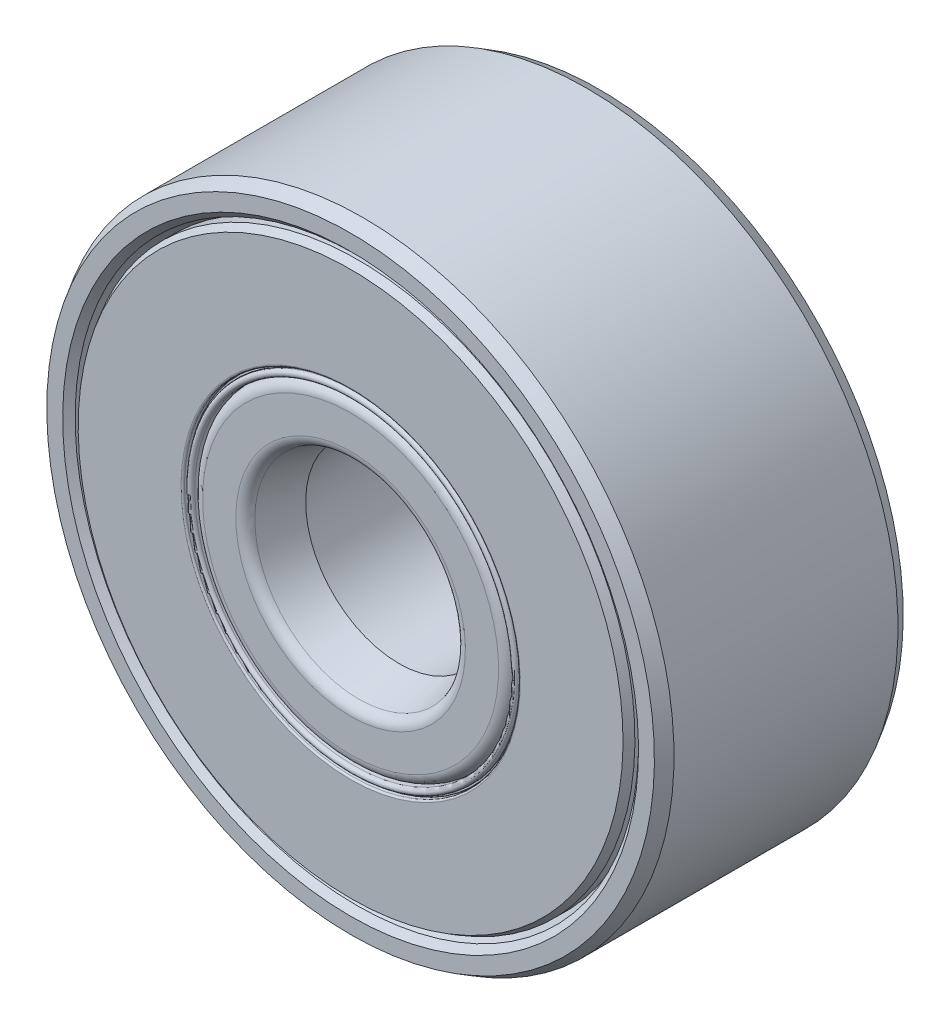
ISO-10303-21;
HEADER;
FILE_DESCRIPTION(('STEP AP214'),'2;1');
FILE_NAME('part.step','',(''),(''),'','','');
FILE_SCHEMA(('AUTOMOTIVE_DESIGN { 1 0 10303 214 1 1 1 1 }'));
ENDSEC;
DATA;
#1=APPLICATION_CONTEXT('core data for automotive mechanical design processes');
#2=APPLICATION_PROTOCOL_DEFINITION('international standard','automotive_design',2000,#1);
#3=PRODUCT_CONTEXT('',#1,'mechanical');
#4=PRODUCT('Part','Part','',(#3));
#5=PRODUCT_RELATED_PRODUCT_CATEGORY('part','',(#4));
#6=PRODUCT_DEFINITION_FORMATION('','',#4);
#7=PRODUCT_DEFINITION_CONTEXT('part definition',#1,'design');
#8=PRODUCT_DEFINITION('design','',#6,#7);
#9=PRODUCT_DEFINITION_SHAPE('','',#8);
#10=(LENGTH_UNIT() NAMED_UNIT(*) SI_UNIT(.MILLI.,.METRE.));
#11=(NAMED_UNIT(*) PLANE_ANGLE_UNIT() SI_UNIT($,.RADIAN.));
#12=(NAMED_UNIT(*) SI_UNIT($,.STERADIAN.) SOLID_ANGLE_UNIT());
#13=UNCERTAINTY_MEASURE_WITH_UNIT(LENGTH_MEASURE(1.E-05),#10,'distance_accuracy_value','');
#14=(GEOMETRIC_REPRESENTATION_CONTEXT(3) GLOBAL_UNCERTAINTY_ASSIGNED_CONTEXT((#13)) GLOBAL_UNIT_ASSIGNED_CONTEXT((#10,
#11,#12)) REPRESENTATION_CONTEXT('',''));
#15=CARTESIAN_POINT('',(0.,0.,0.));
#16=DIRECTION('',(0.,0.,1.));
#17=DIRECTION('',(1.,0.,0.));
#18=AXIS2_PLACEMENT_3D('',#15,#16,#17);
#19=CARTESIAN_POINT('',(0.,2.55833333333333,1.3125));
#20=DIRECTION('',(0.,0.,1.));
#21=DIRECTION('',(0.,-1.,0.));
#22=AXIS2_PLACEMENT_3D('',#19,#20,#21);
#23=PLANE('',#22);
#24=CARTESIAN_POINT('',(0.,0.,1.3125));
#25=DIRECTION('',(0.,0.,1.));
#26=DIRECTION('',(0.,-1.,0.));
#27=AXIS2_PLACEMENT_3D('',#24,#25,#26);
#28=CIRCLE('',#27,2.69833333333333);
#29=CARTESIAN_POINT('',(0.,-2.69833333333333,1.3125));
#30=VERTEX_POINT('',#29);
#31=EDGE_CURVE('E11',#30,#30,#28,.T.);
#32=ORIENTED_EDGE('',*,*,#31,.F.);
#33=EDGE_LOOP('',(#32));
#34=FACE_BOUND('',#33,.T.);
#35=CARTESIAN_POINT('',(0.,0.,1.3125));
#36=DIRECTION('',(0.,0.,1.));
#37=DIRECTION('',(0.,-1.,0.));
#38=AXIS2_PLACEMENT_3D('',#35,#36,#37);
#39=CIRCLE('',#38,2.55833333333333);
#40=CARTESIAN_POINT('',(0.,-2.55833333333333,1.3125));
#41=VERTEX_POINT('',#40);
#42=EDGE_CURVE('E66',#41,#41,#39,.T.);
#43=ORIENTED_EDGE('',*,*,#42,.T.);
#44=EDGE_LOOP('',(#43));
#45=FACE_BOUND('',#44,.T.);
#46=ADVANCED_FACE('F41',(#34,#45),#23,.F.);
#47=CARTESIAN_POINT('',(0.,0.,2.));
#48=DIRECTION('',(0.,0.,1.));
#49=DIRECTION('',(0.,-1.,0.));
#50=AXIS2_PLACEMENT_3D('',#47,#48,#49);
#51=CYLINDRICAL_SURFACE('',#50,2.69833333333333);
#52=CARTESIAN_POINT('',(0.,0.,1.89056210322341));
#53=DIRECTION('',(0.,0.,1.));
#54=DIRECTION('',(0.,-1.,0.));
#55=AXIS2_PLACEMENT_3D('',#52,#53,#54);
#56=CIRCLE('',#55,2.69833333333333);
#57=CARTESIAN_POINT('',(0.,-2.69833333333333,1.89056210322341));
#58=VERTEX_POINT('',#57);
#59=EDGE_CURVE('E47',#58,#58,#56,.T.);
#60=ORIENTED_EDGE('',*,*,#59,.F.);
#61=EDGE_LOOP('',(#60));
#62=FACE_BOUND('',#61,.T.);
#63=ORIENTED_EDGE('',*,*,#31,.T.);
#64=EDGE_LOOP('',(#63));
#65=FACE_BOUND('',#64,.T.);
#66=ADVANCED_FACE('F97',(#62,#65),#51,.T.);
#67=CARTESIAN_POINT('',(0.,0.,1.89056210322341));
#68=DIRECTION('',(0.,0.,-1.));
#69=DIRECTION('',(0.,1.,0.));
#70=AXIS2_PLACEMENT_3D('',#67,#68,#69);
#71=CONICAL_SURFACE('',#70,2.69833333333333,0.17453292519941);
#72=CARTESIAN_POINT('',(0.,0.,1.92503037457884));
#73=DIRECTION('',(0.,0.,1.));
#74=DIRECTION('',(0.,-1.,0.));
#75=AXIS2_PLACEMENT_3D('',#72,#73,#74);
#76=CIRCLE('',#75,2.69225564711499);
#77=CARTESIAN_POINT('',(0.,-2.69225564711499,1.92503037457884));
#78=VERTEX_POINT('',#77);
#79=EDGE_CURVE('E51',#78,#78,#76,.T.);
#80=ORIENTED_EDGE('',*,*,#79,.F.);
#81=EDGE_LOOP('',(#80));
#82=FACE_BOUND('',#81,.T.);
#83=ORIENTED_EDGE('',*,*,#59,.T.);
#84=EDGE_LOOP('',(#83));
#85=FACE_BOUND('',#84,.T.);
#86=ADVANCED_FACE('F92',(#82,#85),#71,.T.);
#87=CARTESIAN_POINT('',(0.,0.,1.9225));
#88=DIRECTION('',(0.,0.,1.));
#89=DIRECTION('',(0.,-1.,0.));
#90=AXIS2_PLACEMENT_3D('',#87,#88,#89);
#91=TOROIDAL_SURFACE('',#90,2.67790517976922,0.0145718464358903);
#92=CARTESIAN_POINT('',(0.,0.,1.9225));
#93=DIRECTION('',(0.,0.,1.));
#94=DIRECTION('',(0.,-1.,0.));
#95=AXIS2_PLACEMENT_3D('',#92,#93,#94);
#96=CIRCLE('',#95,2.66333333333333);
#97=CARTESIAN_POINT('',(0.,-2.66333333333333,1.9225));
#98=VERTEX_POINT('',#97);
#99=EDGE_CURVE('E55',#98,#98,#96,.T.);
#100=ORIENTED_EDGE('',*,*,#99,.F.);
#101=EDGE_LOOP('',(#100));
#102=FACE_BOUND('',#101,.T.);
#103=ORIENTED_EDGE('',*,*,#79,.T.);
#104=EDGE_LOOP('',(#103));
#105=FACE_BOUND('',#104,.T.);
#106=ADVANCED_FACE('F86',(#102,#105),#91,.T.);
#107=CARTESIAN_POINT('',(0.,0.,2.));
#108=DIRECTION('',(0.,0.,1.));
#109=DIRECTION('',(0.,-1.,0.));
#110=AXIS2_PLACEMENT_3D('',#107,#108,#109);
#111=CYLINDRICAL_SURFACE('',#110,2.66333333333333);
#112=CARTESIAN_POINT('',(0.,0.,1.9475));
#113=DIRECTION('',(0.,0.,1.));
#114=DIRECTION('',(0.,-1.,0.));
#115=AXIS2_PLACEMENT_3D('',#112,#113,#114);
#116=CIRCLE('',#115,2.66333333333333);
#117=CARTESIAN_POINT('',(0.,-2.66333333333333,1.9475));
#118=VERTEX_POINT('',#117);
#119=EDGE_CURVE('E60',#118,#118,#116,.T.);
#120=ORIENTED_EDGE('',*,*,#119,.F.);
#121=EDGE_LOOP('',(#120));
#122=FACE_BOUND('',#121,.T.);
#123=ORIENTED_EDGE('',*,*,#99,.T.);
#124=EDGE_LOOP('',(#123));
#125=FACE_BOUND('',#124,.T.);
#126=ADVANCED_FACE('F80',(#122,#125),#111,.T.);
#127=CARTESIAN_POINT('',(0.,0.,1.9475));
#128=DIRECTION('',(0.,0.,1.));
#129=DIRECTION('',(0.,-1.,0.));
#130=AXIS2_PLACEMENT_3D('',#127,#128,#129);
#131=TOROIDAL_SURFACE('',#130,2.61083333333333,0.0525);
#132=CARTESIAN_POINT('',(0.,0.,1.9475));
#133=DIRECTION('',(0.,0.,1.));
#134=DIRECTION('',(0.,-1.,0.));
#135=AXIS2_PLACEMENT_3D('',#132,#133,#134);
#136=CIRCLE('',#135,2.55833333333333);
#137=CARTESIAN_POINT('',(0.,-2.55833333333333,1.9475));
#138=VERTEX_POINT('',#137);
#139=EDGE_CURVE('E63',#138,#138,#136,.T.);
#140=ORIENTED_EDGE('',*,*,#139,.F.);
#141=EDGE_LOOP('',(#140));
#142=FACE_BOUND('',#141,.T.);
#143=ORIENTED_EDGE('',*,*,#119,.T.);
#144=EDGE_LOOP('',(#143));
#145=FACE_BOUND('',#144,.T.);
#146=ADVANCED_FACE('F74',(#142,#145),#131,.T.);
#147=CARTESIAN_POINT('',(0.,0.,2.));
#148=DIRECTION('',(0.,0.,1.));
#149=DIRECTION('',(0.,-1.,0.));
#150=AXIS2_PLACEMENT_3D('',#147,#148,#149);
#151=CYLINDRICAL_SURFACE('',#150,2.55833333333333);
#152=ORIENTED_EDGE('',*,*,#42,.F.);
#153=EDGE_LOOP('',(#152));
#154=FACE_BOUND('',#153,.T.);
#155=ORIENTED_EDGE('',*,*,#139,.T.);
#156=EDGE_LOOP('',(#155));
#157=FACE_BOUND('',#156,.T.);
#158=ADVANCED_FACE('F71',(#154,#157),#151,.F.);
#159=CLOSED_SHELL('',(#46,#66,#86,#106,#126,#146,#158));
#160=MANIFOLD_SOLID_BREP('B2',#159);
#161=CARTESIAN_POINT('',(0.,0.,-2.00000000000001));
#162=DIRECTION('',(0.,0.,1.));
#163=DIRECTION('',(0.,-1.,0.));
#164=AXIS2_PLACEMENT_3D('',#161,#162,#163);
#165=CONICAL_SURFACE('',#164,4.38,0.523598775598299);
#166=CARTESIAN_POINT('',(0.,0.,-1.87875644347018));
#167=DIRECTION('',(0.,0.,1.));
#168=DIRECTION('',(0.,-1.,0.));
#169=AXIS2_PLACEMENT_3D('',#166,#167,#168);
#170=CIRCLE('',#169,4.45);
#171=CARTESIAN_POINT('',(0.,-4.45,-1.87875644347019));
#172=VERTEX_POINT('',#171);
#173=EDGE_CURVE('E177',#172,#172,#170,.T.);
#174=ORIENTED_EDGE('',*,*,#173,.F.);
#175=EDGE_LOOP('',(#174));
#176=FACE_BOUND('',#175,.T.);
#177=CARTESIAN_POINT('',(0.,0.,-2.00000000000001));
#178=DIRECTION('',(0.,0.,1.));
#179=DIRECTION('',(0.,-1.,0.));
#180=AXIS2_PLACEMENT_3D('',#177,#178,#179);
#181=CIRCLE('',#180,4.38);
#182=CARTESIAN_POINT('',(0.,-4.38,-2.00000000000001));
#183=VERTEX_POINT('',#182);
#184=EDGE_CURVE('E40',#183,#183,#181,.T.);
#185=ORIENTED_EDGE('',*,*,#184,.T.);
#186=EDGE_LOOP('',(#185));
#187=FACE_BOUND('',#186,.T.);
#188=ADVANCED_FACE('F155',(#176,#187),#165,.T.);
#189=CARTESIAN_POINT('',(0.,4.38,-2.));
#190=DIRECTION('',(0.,0.,1.));
#191=DIRECTION('',(0.,-1.,0.));
#192=AXIS2_PLACEMENT_3D('',#189,#190,#191);
#193=PLANE('',#192);
#194=ORIENTED_EDGE('',*,*,#184,.F.);
#195=EDGE_LOOP('',(#194));
#196=FACE_BOUND('',#195,.T.);
#197=CARTESIAN_POINT('',(0.,0.,-2.00000000000001));
#198=DIRECTION('',(0.,0.,1.));
#199=DIRECTION('',(0.,-1.,0.));
#200=AXIS2_PLACEMENT_3D('',#197,#198,#199);
#201=CIRCLE('',#200,2.72633333333333);
#202=CARTESIAN_POINT('',(0.,-2.72633333333333,-2.00000000000001));
#203=VERTEX_POINT('',#202);
#204=EDGE_CURVE('E161',#203,#203,#201,.T.);
#205=ORIENTED_EDGE('',*,*,#204,.T.);
#206=EDGE_LOOP('',(#205));
#207=FACE_BOUND('',#206,.T.);
#208=ADVANCED_FACE('F184',(#196,#207),#193,.F.);
#209=CARTESIAN_POINT('',(0.,0.,-1.97200000000001));
#210=DIRECTION('',(0.,0.,1.));
#211=DIRECTION('',(0.,-1.,0.));
#212=AXIS2_PLACEMENT_3D('',#209,#210,#211);
#213=TOROIDAL_SURFACE('',#212,2.72633333333333,0.028);
#214=ORIENTED_EDGE('',*,*,#204,.F.);
#215=EDGE_LOOP('',(#214));
#216=FACE_BOUND('',#215,.T.);
#217=CARTESIAN_POINT('',(0.,0.,-1.97200000000001));
#218=DIRECTION('',(0.,0.,1.));
#219=DIRECTION('',(0.,-1.,0.));
#220=AXIS2_PLACEMENT_3D('',#217,#218,#219);
#221=CIRCLE('',#220,2.69833333333333);
#222=CARTESIAN_POINT('',(0.,-2.69833333333333,-1.97200000000001));
#223=VERTEX_POINT('',#222);
#224=EDGE_CURVE('E165',#223,#223,#221,.T.);
#225=ORIENTED_EDGE('',*,*,#224,.T.);
#226=EDGE_LOOP('',(#225));
#227=FACE_BOUND('',#226,.T.);
#228=ADVANCED_FACE('F188',(#216,#227),#213,.T.);
#229=CARTESIAN_POINT('',(0.,0.,2.));
#230=DIRECTION('',(0.,0.,1.));
#231=DIRECTION('',(0.,-1.,0.));
#232=AXIS2_PLACEMENT_3D('',#229,#230,#231);
#233=CYLINDRICAL_SURFACE('',#232,2.69833333333333);
#234=ORIENTED_EDGE('',*,*,#224,.F.);
#235=EDGE_LOOP('',(#234));
#236=FACE_BOUND('',#235,.T.);
#237=CARTESIAN_POINT('',(0.,0.,-1.3125));
#238=DIRECTION('',(0.,0.,1.));
#239=DIRECTION('',(0.,-1.,0.));
#240=AXIS2_PLACEMENT_3D('',#237,#238,#239);
#241=CIRCLE('',#240,2.69833333333333);
#242=CARTESIAN_POINT('',(0.,-2.69833333333333,-1.3125));
#243=VERTEX_POINT('',#242);
#244=EDGE_CURVE('E169',#243,#243,#241,.T.);
#245=ORIENTED_EDGE('',*,*,#244,.T.);
#246=EDGE_LOOP('',(#245));
#247=FACE_BOUND('',#246,.T.);
#248=ADVANCED_FACE('F193',(#236,#247),#233,.F.);
#249=CARTESIAN_POINT('',(0.,4.45,-1.3125));
#250=DIRECTION('',(0.,0.,-1.));
#251=DIRECTION('',(0.,1.,0.));
#252=AXIS2_PLACEMENT_3D('',#249,#250,#251);
#253=PLANE('',#252);
#254=ORIENTED_EDGE('',*,*,#244,.F.);
#255=EDGE_LOOP('',(#254));
#256=FACE_BOUND('',#255,.T.);
#257=CARTESIAN_POINT('',(0.,0.,-1.3125));
#258=DIRECTION('',(0.,0.,1.));
#259=DIRECTION('',(0.,-1.,0.));
#260=AXIS2_PLACEMENT_3D('',#257,#258,#259);
#261=CIRCLE('',#260,4.45);
#262=CARTESIAN_POINT('',(0.,-4.45,-1.3125));
#263=VERTEX_POINT('',#262);
#264=EDGE_CURVE('E174',#263,#263,#261,.T.);
#265=ORIENTED_EDGE('',*,*,#264,.T.);
#266=EDGE_LOOP('',(#265));
#267=FACE_BOUND('',#266,.T.);
#268=ADVANCED_FACE('F199',(#256,#267),#253,.F.);
#269=CARTESIAN_POINT('',(0.,0.,2.));
#270=DIRECTION('',(0.,0.,1.));
#271=DIRECTION('',(0.,-1.,0.));
#272=AXIS2_PLACEMENT_3D('',#269,#270,#271);
#273=CYLINDRICAL_SURFACE('',#272,4.45);
#274=ORIENTED_EDGE('',*,*,#264,.F.);
#275=EDGE_LOOP('',(#274));
#276=FACE_BOUND('',#275,.T.);
#277=ORIENTED_EDGE('',*,*,#173,.T.);
#278=EDGE_LOOP('',(#277));
#279=FACE_BOUND('',#278,.T.);
#280=ADVANCED_FACE('F181',(#276,#279),#273,.T.);
#281=CLOSED_SHELL('',(#188,#208,#228,#248,#268,#280));
#282=MANIFOLD_SOLID_BREP('B6',#281);
#283=CARTESIAN_POINT('',(0.,4.45,1.3125));
#284=DIRECTION('',(0.,0.,1.));
#285=DIRECTION('',(0.,-1.,0.));
#286=AXIS2_PLACEMENT_3D('',#283,#284,#285);
#287=PLANE('',#286);
#288=CARTESIAN_POINT('',(0.,0.,1.3125));
#289=DIRECTION('',(0.,0.,1.));
#290=DIRECTION('',(0.,-1.,0.));
#291=AXIS2_PLACEMENT_3D('',#288,#289,#290);
#292=CIRCLE('',#291,4.45);
#293=CARTESIAN_POINT('',(0.,-4.45,1.3125));
#294=VERTEX_POINT('',#293);
#295=EDGE_CURVE('E154',#294,#294,#292,.T.);
#296=ORIENTED_EDGE('',*,*,#295,.F.);
#297=EDGE_LOOP('',(#296));
#298=FACE_BOUND('',#297,.T.);
#299=CARTESIAN_POINT('',(0.,0.,1.3125));
#300=DIRECTION('',(0.,0.,1.));
#301=DIRECTION('',(0.,-1.,0.));
#302=AXIS2_PLACEMENT_3D('',#299,#300,#301);
#303=CIRCLE('',#302,2.69833333333333);
#304=CARTESIAN_POINT('',(0.,-2.69833333333333,1.3125));
#305=VERTEX_POINT('',#304);
#306=EDGE_CURVE('E274',#305,#305,#303,.T.);
#307=ORIENTED_EDGE('',*,*,#306,.T.);
#308=EDGE_LOOP('',(#307));
#309=FACE_BOUND('',#308,.T.);
#310=ADVANCED_FACE('F252',(#298,#309),#287,.F.);
#311=CARTESIAN_POINT('',(0.,0.,2.));
#312=DIRECTION('',(0.,0.,1.));
#313=DIRECTION('',(0.,-1.,0.));
#314=AXIS2_PLACEMENT_3D('',#311,#312,#313);
#315=CYLINDRICAL_SURFACE('',#314,4.45);
#316=CARTESIAN_POINT('',(0.,0.,1.87875644347018));
#317=DIRECTION('',(0.,0.,1.));
#318=DIRECTION('',(0.,-1.,0.));
#319=AXIS2_PLACEMENT_3D('',#316,#317,#318);
#320=CIRCLE('',#319,4.45);
#321=CARTESIAN_POINT('',(0.,-4.45,1.87875644347018));
#322=VERTEX_POINT('',#321);
#323=EDGE_CURVE('E258',#322,#322,#320,.T.);
#324=ORIENTED_EDGE('',*,*,#323,.F.);
#325=EDGE_LOOP('',(#324));
#326=FACE_BOUND('',#325,.T.);
#327=ORIENTED_EDGE('',*,*,#295,.T.);
#328=EDGE_LOOP('',(#327));
#329=FACE_BOUND('',#328,.T.);
#330=ADVANCED_FACE('F299',(#326,#329),#315,.T.);
#331=CARTESIAN_POINT('',(0.,0.,1.87875644347018));
#332=DIRECTION('',(0.,0.,-1.));
#333=DIRECTION('',(0.,1.,0.));
#334=AXIS2_PLACEMENT_3D('',#331,#332,#333);
#335=CONICAL_SURFACE('',#334,4.45,0.523598775598299);
#336=CARTESIAN_POINT('',(0.,0.,2.));
#337=DIRECTION('',(0.,0.,1.));
#338=DIRECTION('',(0.,-1.,0.));
#339=AXIS2_PLACEMENT_3D('',#336,#337,#338);
#340=CIRCLE('',#339,4.38);
#341=CARTESIAN_POINT('',(0.,-4.38,2.));
#342=VERTEX_POINT('',#341);
#343=EDGE_CURVE('E262',#342,#342,#340,.T.);
#344=ORIENTED_EDGE('',*,*,#343,.F.);
#345=EDGE_LOOP('',(#344));
#346=FACE_BOUND('',#345,.T.);
#347=ORIENTED_EDGE('',*,*,#323,.T.);
#348=EDGE_LOOP('',(#347));
#349=FACE_BOUND('',#348,.T.);
#350=ADVANCED_FACE('F294',(#346,#349),#335,.T.);
#351=CARTESIAN_POINT('',(0.,4.38,2.));
#352=DIRECTION('',(0.,0.,-1.));
#353=DIRECTION('',(0.,1.,0.));
#354=AXIS2_PLACEMENT_3D('',#351,#352,#353);
#355=PLANE('',#354);
#356=CARTESIAN_POINT('',(0.,0.,2.));
#357=DIRECTION('',(0.,0.,1.));
#358=DIRECTION('',(0.,-1.,0.));
#359=AXIS2_PLACEMENT_3D('',#356,#357,#358);
#360=CIRCLE('',#359,2.72633333333333);
#361=CARTESIAN_POINT('',(0.,-2.72633333333333,2.));
#362=VERTEX_POINT('',#361);
#363=EDGE_CURVE('E266',#362,#362,#360,.T.);
#364=ORIENTED_EDGE('',*,*,#363,.F.);
#365=EDGE_LOOP('',(#364));
#366=FACE_BOUND('',#365,.T.);
#367=ORIENTED_EDGE('',*,*,#343,.T.);
#368=EDGE_LOOP('',(#367));
#369=FACE_BOUND('',#368,.T.);
#370=ADVANCED_FACE('F288',(#366,#369),#355,.F.);
#371=CARTESIAN_POINT('',(0.,0.,1.972));
#372=DIRECTION('',(0.,0.,1.));
#373=DIRECTION('',(0.,-1.,0.));
#374=AXIS2_PLACEMENT_3D('',#371,#372,#373);
#375=TOROIDAL_SURFACE('',#374,2.72633333333333,0.028);
#376=CARTESIAN_POINT('',(0.,0.,1.972));
#377=DIRECTION('',(0.,0.,1.));
#378=DIRECTION('',(0.,-1.,0.));
#379=AXIS2_PLACEMENT_3D('',#376,#377,#378);
#380=CIRCLE('',#379,2.69833333333333);
#381=CARTESIAN_POINT('',(0.,-2.69833333333333,1.972));
#382=VERTEX_POINT('',#381);
#383=EDGE_CURVE('E271',#382,#382,#380,.T.);
#384=ORIENTED_EDGE('',*,*,#383,.F.);
#385=EDGE_LOOP('',(#384));
#386=FACE_BOUND('',#385,.T.);
#387=ORIENTED_EDGE('',*,*,#363,.T.);
#388=EDGE_LOOP('',(#387));
#389=FACE_BOUND('',#388,.T.);
#390=ADVANCED_FACE('F282',(#386,#389),#375,.T.);
#391=CARTESIAN_POINT('',(0.,0.,2.));
#392=DIRECTION('',(0.,0.,1.));
#393=DIRECTION('',(0.,-1.,0.));
#394=AXIS2_PLACEMENT_3D('',#391,#392,#393);
#395=CYLINDRICAL_SURFACE('',#394,2.69833333333333);
#396=ORIENTED_EDGE('',*,*,#306,.F.);
#397=EDGE_LOOP('',(#396));
#398=FACE_BOUND('',#397,.T.);
#399=ORIENTED_EDGE('',*,*,#383,.T.);
#400=EDGE_LOOP('',(#399));
#401=FACE_BOUND('',#400,.T.);
#402=ADVANCED_FACE('F279',(#398,#401),#395,.F.);
#403=CLOSED_SHELL('',(#310,#330,#350,#370,#390,#402));
#404=MANIFOLD_SOLID_BREP('B35',#403);
#405=CARTESIAN_POINT('',(-2.73966781981503,2.18481218068001,0.));
#406=DIRECTION('',(0.,0.,1.));
#407=DIRECTION('',(-0.781831482468022,0.623489801858743,0.));
#408=AXIS2_PLACEMENT_3D('',#405,#406,#407);
#409=SPHERICAL_SURFACE('',#408,1.3125);
#410=CARTESIAN_POINT('',(-2.73966781981503,2.18481218068001,1.3125));
#411=VERTEX_POINT('',#410);
#412=VERTEX_LOOP('',#411);
#413=FACE_BOUND('',#412,.T.);
#414=ADVANCED_FACE('F362',(#413),#409,.T.);
#415=CLOSED_SHELL('',(#414));
#416=MANIFOLD_SOLID_BREP('B149',#415);
#417=CARTESIAN_POINT('',(-3.41630989227048,-0.779750439405219,0.));
#418=DIRECTION('',(0.,0.,1.));
#419=DIRECTION('',(-0.974927912181826,-0.222520933956305,0.));
#420=AXIS2_PLACEMENT_3D('',#417,#418,#419);
#421=SPHERICAL_SURFACE('',#420,1.3125);
#422=CARTESIAN_POINT('',(-3.41630989227048,-0.779750439405219,1.3125));
#423=VERTEX_POINT('',#422);
#424=VERTEX_LOOP('',#423);
#425=FACE_BOUND('',#424,.T.);
#426=ADVANCED_FACE('F380',(#425),#421,.T.);
#427=CLOSED_SHELL('',(#426));
#428=MANIFOLD_SOLID_BREP('B248',#427);
#429=CARTESIAN_POINT('',(-1.52040093582447,-3.15714507460805,0.));
#430=DIRECTION('',(0.,0.,1.));
#431=DIRECTION('',(-0.433883739117565,-0.900968867902416,0.));
#432=AXIS2_PLACEMENT_3D('',#429,#430,#431);
#433=SPHERICAL_SURFACE('',#432,1.3125);
#434=CARTESIAN_POINT('',(-1.52040093582447,-3.15714507460805,1.3125));
#435=VERTEX_POINT('',#434);
#436=VERTEX_LOOP('',#435);
#437=FACE_BOUND('',#436,.T.);
#438=ADVANCED_FACE('F398',(#437),#433,.T.);
#439=CLOSED_SHELL('',(#438));
#440=MANIFOLD_SOLID_BREP('B358',#439);
#441=CARTESIAN_POINT('',(1.52040093582442,-3.15714507460807,0.));
#442=DIRECTION('',(0.,0.,1.));
#443=DIRECTION('',(0.433883739117553,-0.900968867902422,0.));
#444=AXIS2_PLACEMENT_3D('',#441,#442,#443);
#445=SPHERICAL_SURFACE('',#444,1.3125);
#446=CARTESIAN_POINT('',(1.52040093582442,-3.15714507460807,1.3125));
#447=VERTEX_POINT('',#446);
#448=VERTEX_LOOP('',#447);
#449=FACE_BOUND('',#448,.T.);
#450=ADVANCED_FACE('F416',(#449),#445,.T.);
#451=CLOSED_SHELL('',(#450));
#452=MANIFOLD_SOLID_BREP('B376',#451);
#453=CARTESIAN_POINT('',(3.41630989227047,-0.779750439405265,0.));
#454=DIRECTION('',(0.,0.,1.));
#455=DIRECTION('',(0.974927912181823,-0.222520933956318,0.));
#456=AXIS2_PLACEMENT_3D('',#453,#454,#455);
#457=SPHERICAL_SURFACE('',#456,1.3125);
#458=CARTESIAN_POINT('',(3.41630989227047,-0.779750439405265,1.3125));
#459=VERTEX_POINT('',#458);
#460=VERTEX_LOOP('',#459);
#461=FACE_BOUND('',#460,.T.);
#462=ADVANCED_FACE('F434',(#461),#457,.T.);
#463=CLOSED_SHELL('',(#462));
#464=MANIFOLD_SOLID_BREP('B394',#463);
#465=CARTESIAN_POINT('',(2.73966781981506,2.18481218067997,0.));
#466=DIRECTION('',(0.,0.,1.));
#467=DIRECTION('',(0.781831482468031,0.623489801858732,0.));
#468=AXIS2_PLACEMENT_3D('',#465,#466,#467);
#469=SPHERICAL_SURFACE('',#468,1.3125);
#470=CARTESIAN_POINT('',(2.73966781981506,2.18481218067997,1.3125));
#471=VERTEX_POINT('',#470);
#472=VERTEX_LOOP('',#471);
#473=FACE_BOUND('',#472,.T.);
#474=ADVANCED_FACE('F452',(#473),#469,.T.);
#475=CLOSED_SHELL('',(#474));
#476=MANIFOLD_SOLID_BREP('B412',#475);
#477=CARTESIAN_POINT('',(0.,3.50416666666667,0.));
#478=DIRECTION('',(0.,0.,1.));
#479=DIRECTION('',(0.,1.,0.));
#480=AXIS2_PLACEMENT_3D('',#477,#478,#479);
#481=SPHERICAL_SURFACE('',#480,1.3125);
#482=CARTESIAN_POINT('',(0.,3.50416666666667,1.3125));
#483=VERTEX_POINT('',#482);
#484=VERTEX_LOOP('',#483);
#485=FACE_BOUND('',#484,.T.);
#486=ADVANCED_FACE('F472',(#485),#481,.T.);
#487=CLOSED_SHELL('',(#486));
#488=MANIFOLD_SOLID_BREP('B430',#487);
#489=CARTESIAN_POINT('',(0.,0.,-1.82098349380409));
#490=DIRECTION('',(0.,0.,1.));
#491=DIRECTION('',(0.,-1.,0.));
#492=AXIS2_PLACEMENT_3D('',#489,#490,#491);
#493=TOROIDAL_SURFACE('',#492,1.84583333333333,0.179016506195909);
#494=CARTESIAN_POINT('',(0.,0.,-2.));
#495=DIRECTION('',(0.,0.,1.));
#496=DIRECTION('',(0.,-1.,0.));
#497=AXIS2_PLACEMENT_3D('',#494,#495,#496);
#498=CIRCLE('',#497,1.84583333333333);
#499=CARTESIAN_POINT('',(0.,-1.84583333333333,-2.));
#500=VERTEX_POINT('',#499);
#501=EDGE_CURVE('E471',#500,#500,#498,.T.);
#502=ORIENTED_EDGE('',*,*,#501,.F.);
#503=EDGE_LOOP('',(#502));
#504=FACE_BOUND('',#503,.T.);
#505=CARTESIAN_POINT('',(0.,0.,-1.86731637499531));
#506=DIRECTION('',(0.,0.,1.));
#507=DIRECTION('',(0.,-1.,0.));
#508=AXIS2_PLACEMENT_3D('',#505,#506,#507);
#509=CIRCLE('',#508,1.67291666666666);
#510=CARTESIAN_POINT('',(0.,-1.67291666666666,-1.86731637499531));
#511=VERTEX_POINT('',#510);
#512=EDGE_CURVE('E531',#511,#511,#509,.T.);
#513=ORIENTED_EDGE('',*,*,#512,.T.);
#514=EDGE_LOOP('',(#513));
#515=FACE_BOUND('',#514,.T.);
#516=ADVANCED_FACE('F491',(#504,#515),#493,.T.);
#517=CARTESIAN_POINT('',(0.,1.84583333333333,-2.));
#518=DIRECTION('',(0.,0.,1.));
#519=DIRECTION('',(0.,-1.,0.));
#520=AXIS2_PLACEMENT_3D('',#517,#518,#519);
#521=PLANE('',#520);
#522=CARTESIAN_POINT('',(0.,0.,-2.));
#523=DIRECTION('',(0.,0.,1.));
#524=DIRECTION('',(0.,-1.,0.));
#525=AXIS2_PLACEMENT_3D('',#522,#523,#524);
#526=CIRCLE('',#525,2.37931682713742);
#527=CARTESIAN_POINT('',(0.,-2.37931682713742,-2.));
#528=VERTEX_POINT('',#527);
#529=EDGE_CURVE('E497',#528,#528,#526,.T.);
#530=ORIENTED_EDGE('',*,*,#529,.F.);
#531=EDGE_LOOP('',(#530));
#532=FACE_BOUND('',#531,.T.);
#533=ORIENTED_EDGE('',*,*,#501,.T.);
#534=EDGE_LOOP('',(#533));
#535=FACE_BOUND('',#534,.T.);
#536=ADVANCED_FACE('F592',(#532,#535),#521,.F.);
#537=CARTESIAN_POINT('',(0.,0.,-1.82098349380409));
#538=DIRECTION('',(0.,0.,1.));
#539=DIRECTION('',(0.,-1.,0.));
#540=AXIS2_PLACEMENT_3D('',#537,#538,#539);
#541=TOROIDAL_SURFACE('',#540,2.37931682713742,0.179016506195909);
#542=CARTESIAN_POINT('',(0.,0.,-1.82098349380409));
#543=DIRECTION('',(0.,0.,1.));
#544=DIRECTION('',(0.,-1.,0.));
#545=AXIS2_PLACEMENT_3D('',#542,#543,#544);
#546=CIRCLE('',#545,2.55833333333333);
#547=CARTESIAN_POINT('',(0.,-2.55833333333333,-1.82098349380409));
#548=VERTEX_POINT('',#547);
#549=EDGE_CURVE('E501',#548,#548,#546,.T.);
#550=ORIENTED_EDGE('',*,*,#549,.F.);
#551=EDGE_LOOP('',(#550));
#552=FACE_BOUND('',#551,.T.);
#553=ORIENTED_EDGE('',*,*,#529,.T.);
#554=EDGE_LOOP('',(#553));
#555=FACE_BOUND('',#554,.T.);
#556=ADVANCED_FACE('F587',(#552,#555),#541,.T.);
#557=CARTESIAN_POINT('',(0.,0.,2.));
#558=DIRECTION('',(0.,0.,1.));
#559=DIRECTION('',(0.,-1.,0.));
#560=AXIS2_PLACEMENT_3D('',#557,#558,#559);
#561=CYLINDRICAL_SURFACE('',#560,2.55833333333333);
#562=CARTESIAN_POINT('',(0.,0.,-0.909975579647913));
#563=DIRECTION('',(0.,0.,1.));
#564=DIRECTION('',(0.,-1.,0.));
#565=AXIS2_PLACEMENT_3D('',#562,#563,#564);
#566=CIRCLE('',#565,2.55833333333333);
#567=CARTESIAN_POINT('',(0.,-2.55833333333333,-0.909975579647913));
#568=VERTEX_POINT('',#567);
#569=EDGE_CURVE('E505',#568,#568,#566,.T.);
#570=ORIENTED_EDGE('',*,*,#569,.F.);
#571=EDGE_LOOP('',(#570));
#572=FACE_BOUND('',#571,.T.);
#573=ORIENTED_EDGE('',*,*,#549,.T.);
#574=EDGE_LOOP('',(#573));
#575=FACE_BOUND('',#574,.T.);
#576=ADVANCED_FACE('F581',(#572,#575),#561,.T.);
#577=CARTESIAN_POINT('',(0.,0.,0.));
#578=DIRECTION('',(0.,0.,1.));
#579=DIRECTION('',(0.,-1.,0.));
#580=AXIS2_PLACEMENT_3D('',#577,#578,#579);
#581=TOROIDAL_SURFACE('',#580,3.50416666666667,1.3125);
#582=CARTESIAN_POINT('',(0.,0.,0.909975579647911));
#583=DIRECTION('',(0.,0.,1.));
#584=DIRECTION('',(0.,-1.,0.));
#585=AXIS2_PLACEMENT_3D('',#582,#583,#584);
#586=CIRCLE('',#585,2.55833333333333);
#587=CARTESIAN_POINT('',(0.,-2.55833333333333,0.909975579647911));
#588=VERTEX_POINT('',#587);
#589=EDGE_CURVE('E510',#588,#588,#586,.T.);
#590=ORIENTED_EDGE('',*,*,#589,.F.);
#591=EDGE_LOOP('',(#590));
#592=FACE_BOUND('',#591,.T.);
#593=ORIENTED_EDGE('',*,*,#569,.T.);
#594=EDGE_LOOP('',(#593));
#595=FACE_BOUND('',#594,.T.);
#596=ADVANCED_FACE('F575',(#592,#595),#581,.F.);
#597=CARTESIAN_POINT('',(0.,0.,2.));
#598=DIRECTION('',(0.,0.,1.));
#599=DIRECTION('',(0.,-1.,0.));
#600=AXIS2_PLACEMENT_3D('',#597,#598,#599);
#601=CYLINDRICAL_SURFACE('',#600,2.55833333333333);
#602=CARTESIAN_POINT('',(0.,0.,1.82098349380409));
#603=DIRECTION('',(0.,0.,1.));
#604=DIRECTION('',(0.,-1.,0.));
#605=AXIS2_PLACEMENT_3D('',#602,#603,#604);
#606=CIRCLE('',#605,2.55833333333333);
#607=CARTESIAN_POINT('',(0.,-2.55833333333333,1.82098349380409));
#608=VERTEX_POINT('',#607);
#609=EDGE_CURVE('E513',#608,#608,#606,.T.);
#610=ORIENTED_EDGE('',*,*,#609,.F.);
#611=EDGE_LOOP('',(#610));
#612=FACE_BOUND('',#611,.T.);
#613=ORIENTED_EDGE('',*,*,#589,.T.);
#614=EDGE_LOOP('',(#613));
#615=FACE_BOUND('',#614,.T.);
#616=ADVANCED_FACE('F569',(#612,#615),#601,.T.);
#617=CARTESIAN_POINT('',(0.,0.,1.82098349380409));
#618=DIRECTION('',(0.,0.,1.));
#619=DIRECTION('',(0.,-1.,0.));
#620=AXIS2_PLACEMENT_3D('',#617,#618,#619);
#621=TOROIDAL_SURFACE('',#620,2.37931682713742,0.179016506195909);
#622=CARTESIAN_POINT('',(0.,0.,2.));
#623=DIRECTION('',(0.,0.,1.));
#624=DIRECTION('',(0.,-1.,0.));
#625=AXIS2_PLACEMENT_3D('',#622,#623,#624);
#626=CIRCLE('',#625,2.37931682713742);
#627=CARTESIAN_POINT('',(0.,-2.37931682713742,2.));
#628=VERTEX_POINT('',#627);
#629=EDGE_CURVE('E516',#628,#628,#626,.T.);
#630=ORIENTED_EDGE('',*,*,#629,.F.);
#631=EDGE_LOOP('',(#630));
#632=FACE_BOUND('',#631,.T.);
#633=ORIENTED_EDGE('',*,*,#609,.T.);
#634=EDGE_LOOP('',(#633));
#635=FACE_BOUND('',#634,.T.);
#636=ADVANCED_FACE('F563',(#632,#635),#621,.T.);
#637=CARTESIAN_POINT('',(0.,1.84583333333333,2.));
#638=DIRECTION('',(0.,0.,-1.));
#639=DIRECTION('',(0.,1.,0.));
#640=AXIS2_PLACEMENT_3D('',#637,#638,#639);
#641=PLANE('',#640);
#642=CARTESIAN_POINT('',(0.,0.,2.));
#643=DIRECTION('',(0.,0.,1.));
#644=DIRECTION('',(0.,-1.,0.));
#645=AXIS2_PLACEMENT_3D('',#642,#643,#644);
#646=CIRCLE('',#645,1.84583333333333);
#647=CARTESIAN_POINT('',(0.,-1.84583333333333,2.));
#648=VERTEX_POINT('',#647);
#649=EDGE_CURVE('E519',#648,#648,#646,.T.);
#650=ORIENTED_EDGE('',*,*,#649,.F.);
#651=EDGE_LOOP('',(#650));
#652=FACE_BOUND('',#651,.T.);
#653=ORIENTED_EDGE('',*,*,#629,.T.);
#654=EDGE_LOOP('',(#653));
#655=FACE_BOUND('',#654,.T.);
#656=ADVANCED_FACE('F557',(#652,#655),#641,.F.);
#657=CARTESIAN_POINT('',(0.,0.,1.82098349380409));
#658=DIRECTION('',(0.,0.,1.));
#659=DIRECTION('',(0.,-1.,0.));
#660=AXIS2_PLACEMENT_3D('',#657,#658,#659);
#661=TOROIDAL_SURFACE('',#660,1.84583333333333,0.17901650619591);
#662=CARTESIAN_POINT('',(0.,0.,1.86731637499531));
#663=DIRECTION('',(0.,0.,1.));
#664=DIRECTION('',(0.,-1.,0.));
#665=AXIS2_PLACEMENT_3D('',#662,#663,#664);
#666=CIRCLE('',#665,1.67291666666667);
#667=CARTESIAN_POINT('',(0.,-1.67291666666667,1.86731637499531));
#668=VERTEX_POINT('',#667);
#669=EDGE_CURVE('E522',#668,#668,#666,.T.);
#670=ORIENTED_EDGE('',*,*,#669,.F.);
#671=EDGE_LOOP('',(#670));
#672=FACE_BOUND('',#671,.T.);
#673=ORIENTED_EDGE('',*,*,#649,.T.);
#674=EDGE_LOOP('',(#673));
#675=FACE_BOUND('',#674,.T.);
#676=ADVANCED_FACE('F551',(#672,#675),#661,.T.);
#677=CARTESIAN_POINT('',(0.,0.,1.86731637499531));
#678=DIRECTION('',(0.,0.,1.));
#679=DIRECTION('',(0.,-1.,0.));
#680=AXIS2_PLACEMENT_3D('',#677,#678,#679);
#681=CONICAL_SURFACE('',#680,1.67291666666667,0.26179938779915);
#682=CARTESIAN_POINT('',(0.,0.,1.22198258951986));
#683=DIRECTION('',(0.,0.,1.));
#684=DIRECTION('',(0.,-1.,0.));
#685=AXIS2_PLACEMENT_3D('',#682,#683,#684);
#686=CIRCLE('',#685,1.5);
#687=CARTESIAN_POINT('',(0.,-1.5,1.22198258951986));
#688=VERTEX_POINT('',#687);
#689=EDGE_CURVE('E525',#688,#688,#686,.T.);
#690=ORIENTED_EDGE('',*,*,#689,.F.);
#691=EDGE_LOOP('',(#690));
#692=FACE_BOUND('',#691,.T.);
#693=ORIENTED_EDGE('',*,*,#669,.T.);
#694=EDGE_LOOP('',(#693));
#695=FACE_BOUND('',#694,.T.);
#696=ADVANCED_FACE('F545',(#692,#695),#681,.F.);
#697=CARTESIAN_POINT('',(0.,0.,2.));
#698=DIRECTION('',(0.,0.,1.));
#699=DIRECTION('',(0.,-1.,0.));
#700=AXIS2_PLACEMENT_3D('',#697,#698,#699);
#701=CYLINDRICAL_SURFACE('',#700,1.5);
#702=CARTESIAN_POINT('',(0.,0.,-1.22198258951986));
#703=DIRECTION('',(0.,0.,1.));
#704=DIRECTION('',(0.,-1.,0.));
#705=AXIS2_PLACEMENT_3D('',#702,#703,#704);
#706=CIRCLE('',#705,1.5);
#707=CARTESIAN_POINT('',(0.,-1.5,-1.22198258951986));
#708=VERTEX_POINT('',#707);
#709=EDGE_CURVE('E528',#708,#708,#706,.T.);
#710=ORIENTED_EDGE('',*,*,#709,.F.);
#711=EDGE_LOOP('',(#710));
#712=FACE_BOUND('',#711,.T.);
#713=ORIENTED_EDGE('',*,*,#689,.T.);
#714=EDGE_LOOP('',(#713));
#715=FACE_BOUND('',#714,.T.);
#716=ADVANCED_FACE('F539',(#712,#715),#701,.F.);
#717=CARTESIAN_POINT('',(0.,0.,-1.22198258951986));
#718=DIRECTION('',(0.,0.,-1.));
#719=DIRECTION('',(0.,1.,0.));
#720=AXIS2_PLACEMENT_3D('',#717,#718,#719);
#721=CONICAL_SURFACE('',#720,1.5,0.261799387799151);
#722=ORIENTED_EDGE('',*,*,#512,.F.);
#723=EDGE_LOOP('',(#722));
#724=FACE_BOUND('',#723,.T.);
#725=ORIENTED_EDGE('',*,*,#709,.T.);
#726=EDGE_LOOP('',(#725));
#727=FACE_BOUND('',#726,.T.);
#728=ADVANCED_FACE('F536',(#724,#727),#721,.F.);
#729=CLOSED_SHELL('',(#516,#536,#556,#576,#596,#616,#636,#656,#676,#696,#716,#728));
#730=MANIFOLD_SOLID_BREP('B448',#729);
#731=CARTESIAN_POINT('',(0.,0.,2.));
#732=DIRECTION('',(0.,0.,1.));
#733=DIRECTION('',(0.,-1.,0.));
#734=AXIS2_PLACEMENT_3D('',#731,#732,#733);
#735=CYLINDRICAL_SURFACE('',#734,4.45);
#736=CARTESIAN_POINT('',(0.,0.,0.909975579647909));
#737=DIRECTION('',(0.,0.,1.));
#738=DIRECTION('',(0.,-1.,0.));
#739=AXIS2_PLACEMENT_3D('',#736,#737,#738);
#740=CIRCLE('',#739,4.45);
#741=CARTESIAN_POINT('',(0.,-4.45,0.909975579647908));
#742=VERTEX_POINT('',#741);
#743=EDGE_CURVE('E490',#742,#742,#740,.T.);
#744=ORIENTED_EDGE('',*,*,#743,.F.);
#745=EDGE_LOOP('',(#744));
#746=FACE_BOUND('',#745,.T.);
#747=CARTESIAN_POINT('',(0.,0.,1.6829872849735));
#748=DIRECTION('',(0.,0.,1.));
#749=DIRECTION('',(0.,-1.,0.));
#750=AXIS2_PLACEMENT_3D('',#747,#748,#749);
#751=CIRCLE('',#750,4.45);
#752=CARTESIAN_POINT('',(0.,-4.45,1.6829872849735));
#753=VERTEX_POINT('',#752);
#754=EDGE_CURVE('E712',#753,#753,#751,.T.);
#755=ORIENTED_EDGE('',*,*,#754,.T.);
#756=EDGE_LOOP('',(#755));
#757=FACE_BOUND('',#756,.T.);
#758=ADVANCED_FACE('F672',(#746,#757),#735,.F.);
#759=CARTESIAN_POINT('',(0.,0.,0.));
#760=DIRECTION('',(0.,0.,1.));
#761=DIRECTION('',(0.,-1.,0.));
#762=AXIS2_PLACEMENT_3D('',#759,#760,#761);
#763=TOROIDAL_SURFACE('',#762,3.50416666666667,1.3125);
#764=CARTESIAN_POINT('',(0.,0.,-0.909975579647913));
#765=DIRECTION('',(0.,0.,1.));
#766=DIRECTION('',(0.,-1.,0.));
#767=AXIS2_PLACEMENT_3D('',#764,#765,#766);
#768=CIRCLE('',#767,4.45);
#769=CARTESIAN_POINT('',(0.,-4.45,-0.909975579647913));
#770=VERTEX_POINT('',#769);
#771=EDGE_CURVE('E678',#770,#770,#768,.T.);
#772=ORIENTED_EDGE('',*,*,#771,.F.);
#773=EDGE_LOOP('',(#772));
#774=FACE_BOUND('',#773,.T.);
#775=ORIENTED_EDGE('',*,*,#743,.T.);
#776=EDGE_LOOP('',(#775));
#777=FACE_BOUND('',#776,.T.);
#778=ADVANCED_FACE('F773',(#774,#777),#763,.F.);
#779=CARTESIAN_POINT('',(0.,0.,2.));
#780=DIRECTION('',(0.,0.,1.));
#781=DIRECTION('',(0.,-1.,0.));
#782=AXIS2_PLACEMENT_3D('',#779,#780,#781);
#783=CYLINDRICAL_SURFACE('',#782,4.45);
#784=CARTESIAN_POINT('',(0.,0.,-1.68298728497351));
#785=DIRECTION('',(0.,0.,1.));
#786=DIRECTION('',(0.,-1.,0.));
#787=AXIS2_PLACEMENT_3D('',#784,#785,#786);
#788=CIRCLE('',#787,4.45);
#789=CARTESIAN_POINT('',(0.,-4.45,-1.68298728497351));
#790=VERTEX_POINT('',#789);
#791=EDGE_CURVE('E682',#790,#790,#788,.T.);
#792=ORIENTED_EDGE('',*,*,#791,.F.);
#793=EDGE_LOOP('',(#792));
#794=FACE_BOUND('',#793,.T.);
#795=ORIENTED_EDGE('',*,*,#771,.T.);
#796=EDGE_LOOP('',(#795));
#797=FACE_BOUND('',#796,.T.);
#798=ADVANCED_FACE('F768',(#794,#797),#783,.F.);
#799=CARTESIAN_POINT('',(0.,0.,-1.68298728497351));
#800=DIRECTION('',(0.,0.,-1.));
#801=DIRECTION('',(0.,1.,0.));
#802=AXIS2_PLACEMENT_3D('',#799,#800,#801);
#803=CONICAL_SURFACE('',#802,4.45,0.349065850398861);
#804=CARTESIAN_POINT('',(0.,0.,-1.90000000000001));
#805=DIRECTION('',(0.,0.,1.));
#806=DIRECTION('',(0.,-1.,0.));
#807=AXIS2_PLACEMENT_3D('',#804,#805,#806);
#808=CIRCLE('',#807,4.52898616872694);
#809=CARTESIAN_POINT('',(0.,-4.52898616872694,-1.90000000000001));
#810=VERTEX_POINT('',#809);
#811=EDGE_CURVE('E686',#810,#810,#808,.T.);
#812=ORIENTED_EDGE('',*,*,#811,.F.);
#813=EDGE_LOOP('',(#812));
#814=FACE_BOUND('',#813,.T.);
#815=ORIENTED_EDGE('',*,*,#791,.T.);
#816=EDGE_LOOP('',(#815));
#817=FACE_BOUND('',#816,.T.);
#818=ADVANCED_FACE('F762',(#814,#817),#803,.F.);
#819=CARTESIAN_POINT('',(0.,0.,-1.90000000000001));
#820=DIRECTION('',(0.,0.,-1.));
#821=DIRECTION('',(0.,1.,0.));
#822=AXIS2_PLACEMENT_3D('',#819,#820,#821);
#823=CONICAL_SURFACE('',#822,4.52898616872694,0.785398163397448);
#824=CARTESIAN_POINT('',(0.,0.,-2.));
#825=DIRECTION('',(0.,0.,1.));
#826=DIRECTION('',(0.,-1.,0.));
#827=AXIS2_PLACEMENT_3D('',#824,#825,#826);
#828=CIRCLE('',#827,4.62898616872694);
#829=CARTESIAN_POINT('',(0.,-4.62898616872694,-2.00000000000001));
#830=VERTEX_POINT('',#829);
#831=EDGE_CURVE('E691',#830,#830,#828,.T.);
#832=ORIENTED_EDGE('',*,*,#831,.F.);
#833=EDGE_LOOP('',(#832));
#834=FACE_BOUND('',#833,.T.);
#835=ORIENTED_EDGE('',*,*,#811,.T.);
#836=EDGE_LOOP('',(#835));
#837=FACE_BOUND('',#836,.T.);
#838=ADVANCED_FACE('F756',(#834,#837),#823,.F.);
#839=CARTESIAN_POINT('',(0.,4.88452994616208,-2.));
#840=DIRECTION('',(0.,0.,1.));
#841=DIRECTION('',(0.,-1.,0.));
#842=AXIS2_PLACEMENT_3D('',#839,#840,#841);
#843=PLANE('',#842);
#844=CARTESIAN_POINT('',(0.,0.,-2.));
#845=DIRECTION('',(0.,0.,1.));
#846=DIRECTION('',(0.,-1.,0.));
#847=AXIS2_PLACEMENT_3D('',#844,#845,#846);
#848=CIRCLE('',#847,4.88452994616208);
#849=CARTESIAN_POINT('',(0.,-4.88452994616208,-2.00000000000001));
#850=VERTEX_POINT('',#849);
#851=EDGE_CURVE('E694',#850,#850,#848,.T.);
#852=ORIENTED_EDGE('',*,*,#851,.F.);
#853=EDGE_LOOP('',(#852));
#854=FACE_BOUND('',#853,.T.);
#855=ORIENTED_EDGE('',*,*,#831,.T.);
#856=EDGE_LOOP('',(#855));
#857=FACE_BOUND('',#856,.T.);
#858=ADVANCED_FACE('F750',(#854,#857),#843,.F.);
#859=CARTESIAN_POINT('',(0.,0.,-2.));
#860=DIRECTION('',(0.,0.,1.));
#861=DIRECTION('',(0.,-1.,0.));
#862=AXIS2_PLACEMENT_3D('',#859,#860,#861);
#863=CONICAL_SURFACE('',#862,4.88452994616208,0.52359877559829);
#864=CARTESIAN_POINT('',(0.,0.,-1.8));
#865=DIRECTION('',(0.,0.,1.));
#866=DIRECTION('',(0.,-1.,0.));
#867=AXIS2_PLACEMENT_3D('',#864,#865,#866);
#868=CIRCLE('',#867,5.);
#869=CARTESIAN_POINT('',(0.,-5.,-1.8));
#870=VERTEX_POINT('',#869);
#871=EDGE_CURVE('E697',#870,#870,#868,.T.);
#872=ORIENTED_EDGE('',*,*,#871,.F.);
#873=EDGE_LOOP('',(#872));
#874=FACE_BOUND('',#873,.T.);
#875=ORIENTED_EDGE('',*,*,#851,.T.);
#876=EDGE_LOOP('',(#875));
#877=FACE_BOUND('',#876,.T.);
#878=ADVANCED_FACE('F744',(#874,#877),#863,.T.);
#879=CARTESIAN_POINT('',(0.,0.,2.));
#880=DIRECTION('',(0.,0.,1.));
#881=DIRECTION('',(0.,-1.,0.));
#882=AXIS2_PLACEMENT_3D('',#879,#880,#881);
#883=CYLINDRICAL_SURFACE('',#882,5.);
#884=CARTESIAN_POINT('',(0.,0.,1.8));
#885=DIRECTION('',(0.,0.,1.));
#886=DIRECTION('',(0.,-1.,0.));
#887=AXIS2_PLACEMENT_3D('',#884,#885,#886);
#888=CIRCLE('',#887,5.);
#889=CARTESIAN_POINT('',(0.,-5.,1.8));
#890=VERTEX_POINT('',#889);
#891=EDGE_CURVE('E700',#890,#890,#888,.T.);
#892=ORIENTED_EDGE('',*,*,#891,.F.);
#893=EDGE_LOOP('',(#892));
#894=FACE_BOUND('',#893,.T.);
#895=ORIENTED_EDGE('',*,*,#871,.T.);
#896=EDGE_LOOP('',(#895));
#897=FACE_BOUND('',#896,.T.);
#898=ADVANCED_FACE('F738',(#894,#897),#883,.T.);
#899=CARTESIAN_POINT('',(0.,0.,1.8));
#900=DIRECTION('',(0.,0.,-1.));
#901=DIRECTION('',(0.,1.,0.));
#902=AXIS2_PLACEMENT_3D('',#899,#900,#901);
#903=CONICAL_SURFACE('',#902,5.,0.523598775598291);
#904=CARTESIAN_POINT('',(0.,0.,2.));
#905=DIRECTION('',(0.,0.,1.));
#906=DIRECTION('',(0.,-1.,0.));
#907=AXIS2_PLACEMENT_3D('',#904,#905,#906);
#908=CIRCLE('',#907,4.88452994616208);
#909=CARTESIAN_POINT('',(0.,-4.88452994616208,2.));
#910=VERTEX_POINT('',#909);
#911=EDGE_CURVE('E703',#910,#910,#908,.T.);
#912=ORIENTED_EDGE('',*,*,#911,.F.);
#913=EDGE_LOOP('',(#912));
#914=FACE_BOUND('',#913,.T.);
#915=ORIENTED_EDGE('',*,*,#891,.T.);
#916=EDGE_LOOP('',(#915));
#917=FACE_BOUND('',#916,.T.);
#918=ADVANCED_FACE('F732',(#914,#917),#903,.T.);
#919=CARTESIAN_POINT('',(0.,4.88452994616208,2.));
#920=DIRECTION('',(0.,0.,-1.));
#921=DIRECTION('',(0.,1.,0.));
#922=AXIS2_PLACEMENT_3D('',#919,#920,#921);
#923=PLANE('',#922);
#924=CARTESIAN_POINT('',(0.,0.,2.));
#925=DIRECTION('',(0.,0.,1.));
#926=DIRECTION('',(0.,-1.,0.));
#927=AXIS2_PLACEMENT_3D('',#924,#925,#926);
#928=CIRCLE('',#927,4.62898616872694);
#929=CARTESIAN_POINT('',(0.,-4.62898616872694,2.));
#930=VERTEX_POINT('',#929);
#931=EDGE_CURVE('E706',#930,#930,#928,.T.);
#932=ORIENTED_EDGE('',*,*,#931,.F.);
#933=EDGE_LOOP('',(#932));
#934=FACE_BOUND('',#933,.T.);
#935=ORIENTED_EDGE('',*,*,#911,.T.);
#936=EDGE_LOOP('',(#935));
#937=FACE_BOUND('',#936,.T.);
#938=ADVANCED_FACE('F726',(#934,#937),#923,.F.);
#939=CARTESIAN_POINT('',(0.,0.,2.));
#940=DIRECTION('',(0.,0.,1.));
#941=DIRECTION('',(0.,-1.,0.));
#942=AXIS2_PLACEMENT_3D('',#939,#940,#941);
#943=CONICAL_SURFACE('',#942,4.62898616872694,0.785398163397449);
#944=CARTESIAN_POINT('',(0.,0.,1.9));
#945=DIRECTION('',(0.,0.,1.));
#946=DIRECTION('',(0.,-1.,0.));
#947=AXIS2_PLACEMENT_3D('',#944,#945,#946);
#948=CIRCLE('',#947,4.52898616872694);
#949=CARTESIAN_POINT('',(0.,-4.52898616872694,1.9));
#950=VERTEX_POINT('',#949);
#951=EDGE_CURVE('E709',#950,#950,#948,.T.);
#952=ORIENTED_EDGE('',*,*,#951,.F.);
#953=EDGE_LOOP('',(#952));
#954=FACE_BOUND('',#953,.T.);
#955=ORIENTED_EDGE('',*,*,#931,.T.);
#956=EDGE_LOOP('',(#955));
#957=FACE_BOUND('',#956,.T.);
#958=ADVANCED_FACE('F720',(#954,#957),#943,.F.);
#959=CARTESIAN_POINT('',(0.,0.,1.9));
#960=DIRECTION('',(0.,0.,1.));
#961=DIRECTION('',(0.,-1.,0.));
#962=AXIS2_PLACEMENT_3D('',#959,#960,#961);
#963=CONICAL_SURFACE('',#962,4.52898616872694,0.349065850398858);
#964=ORIENTED_EDGE('',*,*,#754,.F.);
#965=EDGE_LOOP('',(#964));
#966=FACE_BOUND('',#965,.T.);
#967=ORIENTED_EDGE('',*,*,#951,.T.);
#968=EDGE_LOOP('',(#967));
#969=FACE_BOUND('',#968,.T.);
#970=ADVANCED_FACE('F717',(#966,#969),#963,.F.);
#971=CLOSED_SHELL('',(#758,#778,#798,#818,#838,#858,#878,#898,#918,#938,#958,#970));
#972=MANIFOLD_SOLID_BREP('B466',#971);
#973=ADVANCED_BREP_SHAPE_REPRESENTATION('',(#18,#160,#282,#404,#416,#428,#440,#452,#464,#476,
#488,#730,#972),#14);
#974=SHAPE_DEFINITION_REPRESENTATION(#9,#973);
ENDSEC;
END-ISO-10303-21;
